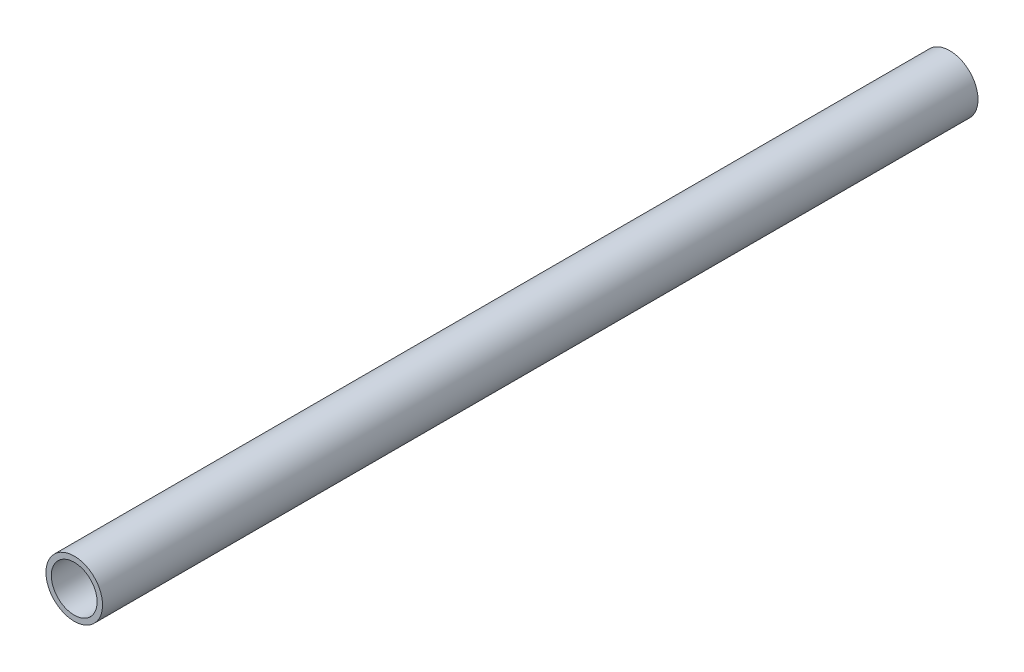
ISO-10303-21;
HEADER;
FILE_DESCRIPTION(('STEP AP214'),'2;1');
FILE_NAME('part.step','',(''),(''),'','','');
FILE_SCHEMA(('AUTOMOTIVE_DESIGN { 1 0 10303 214 1 1 1 1 }'));
ENDSEC;
DATA;
#1=APPLICATION_CONTEXT('core data for automotive mechanical design processes');
#2=APPLICATION_PROTOCOL_DEFINITION('international standard','automotive_design',2000,#1);
#3=PRODUCT_CONTEXT('',#1,'mechanical');
#4=PRODUCT('Part','Part','',(#3));
#5=PRODUCT_RELATED_PRODUCT_CATEGORY('part','',(#4));
#6=PRODUCT_DEFINITION_FORMATION('','',#4);
#7=PRODUCT_DEFINITION_CONTEXT('part definition',#1,'design');
#8=PRODUCT_DEFINITION('design','',#6,#7);
#9=PRODUCT_DEFINITION_SHAPE('','',#8);
#10=(LENGTH_UNIT() NAMED_UNIT(*) SI_UNIT(.MILLI.,.METRE.));
#11=(NAMED_UNIT(*) PLANE_ANGLE_UNIT() SI_UNIT($,.RADIAN.));
#12=(NAMED_UNIT(*) SI_UNIT($,.STERADIAN.) SOLID_ANGLE_UNIT());
#13=UNCERTAINTY_MEASURE_WITH_UNIT(LENGTH_MEASURE(1.E-05),#10,'distance_accuracy_value','');
#14=(GEOMETRIC_REPRESENTATION_CONTEXT(3) GLOBAL_UNCERTAINTY_ASSIGNED_CONTEXT((#13)) GLOBAL_UNIT_ASSIGNED_CONTEXT((#10,
#11,#12)) REPRESENTATION_CONTEXT('',''));
#15=CARTESIAN_POINT('',(0.,0.,0.));
#16=DIRECTION('',(0.,0.,1.));
#17=DIRECTION('',(1.,0.,0.));
#18=AXIS2_PLACEMENT_3D('',#15,#16,#17);
#19=CARTESIAN_POINT('',(0.,0.,247.65));
#20=DIRECTION('',(0.,0.,1.));
#21=DIRECTION('',(1.,0.,0.));
#22=AXIS2_PLACEMENT_3D('',#19,#20,#21);
#23=PLANE('',#22);
#24=CARTESIAN_POINT('',(0.,0.,247.65));
#25=DIRECTION('',(0.,0.,1.));
#26=DIRECTION('',(1.,0.,0.));
#27=AXIS2_PLACEMENT_3D('',#24,#25,#26);
#28=CIRCLE('',#27,8.001);
#29=CARTESIAN_POINT('',(8.001,0.,247.65));
#30=VERTEX_POINT('',#29);
#31=EDGE_CURVE('E10',#30,#30,#28,.T.);
#32=ORIENTED_EDGE('',*,*,#31,.T.);
#33=EDGE_LOOP('',(#32));
#34=FACE_BOUND('',#33,.T.);
#35=CARTESIAN_POINT('',(0.,0.,247.65));
#36=DIRECTION('',(0.,0.,1.));
#37=DIRECTION('',(1.,0.,0.));
#38=AXIS2_PLACEMENT_3D('',#35,#36,#37);
#39=CIRCLE('',#38,6.477);
#40=CARTESIAN_POINT('',(6.477,0.,247.65));
#41=VERTEX_POINT('',#40);
#42=EDGE_CURVE('E44',#41,#41,#39,.T.);
#43=ORIENTED_EDGE('',*,*,#42,.F.);
#44=EDGE_LOOP('',(#43));
#45=FACE_BOUND('',#44,.T.);
#46=ADVANCED_FACE('F33',(#34,#45),#23,.T.);
#47=CARTESIAN_POINT('',(0.,0.,0.));
#48=DIRECTION('',(0.,0.,1.));
#49=DIRECTION('',(1.,0.,0.));
#50=AXIS2_PLACEMENT_3D('',#47,#48,#49);
#51=PLANE('',#50);
#52=CARTESIAN_POINT('',(0.,0.,0.));
#53=DIRECTION('',(0.,0.,1.));
#54=DIRECTION('',(1.,0.,0.));
#55=AXIS2_PLACEMENT_3D('',#52,#53,#54);
#56=CIRCLE('',#55,8.001);
#57=CARTESIAN_POINT('',(8.001,0.,0.));
#58=VERTEX_POINT('',#57);
#59=EDGE_CURVE('E37',#58,#58,#56,.T.);
#60=ORIENTED_EDGE('',*,*,#59,.F.);
#61=EDGE_LOOP('',(#60));
#62=FACE_BOUND('',#61,.T.);
#63=CARTESIAN_POINT('',(0.,0.,0.));
#64=DIRECTION('',(0.,0.,1.));
#65=DIRECTION('',(1.,0.,0.));
#66=AXIS2_PLACEMENT_3D('',#63,#64,#65);
#67=CIRCLE('',#66,6.477);
#68=CARTESIAN_POINT('',(6.477,0.,0.));
#69=VERTEX_POINT('',#68);
#70=EDGE_CURVE('E46',#69,#69,#67,.T.);
#71=ORIENTED_EDGE('',*,*,#70,.T.);
#72=EDGE_LOOP('',(#71));
#73=FACE_BOUND('',#72,.T.);
#74=ADVANCED_FACE('F56',(#62,#73),#51,.F.);
#75=CARTESIAN_POINT('',(0.,0.,247.65));
#76=DIRECTION('',(0.,0.,-1.));
#77=DIRECTION('',(-1.,0.,0.));
#78=AXIS2_PLACEMENT_3D('',#75,#76,#77);
#79=CYLINDRICAL_SURFACE('',#78,8.001);
#80=ORIENTED_EDGE('',*,*,#31,.F.);
#81=EDGE_LOOP('',(#80));
#82=FACE_BOUND('',#81,.T.);
#83=ORIENTED_EDGE('',*,*,#59,.T.);
#84=EDGE_LOOP('',(#83));
#85=FACE_BOUND('',#84,.T.);
#86=ADVANCED_FACE('F35',(#82,#85),#79,.T.);
#87=CARTESIAN_POINT('',(0.,0.,247.65));
#88=DIRECTION('',(0.,0.,-1.));
#89=DIRECTION('',(-1.,0.,0.));
#90=AXIS2_PLACEMENT_3D('',#87,#88,#89);
#91=CYLINDRICAL_SURFACE('',#90,6.477);
#92=ORIENTED_EDGE('',*,*,#42,.T.);
#93=EDGE_LOOP('',(#92));
#94=FACE_BOUND('',#93,.T.);
#95=ORIENTED_EDGE('',*,*,#70,.F.);
#96=EDGE_LOOP('',(#95));
#97=FACE_BOUND('',#96,.T.);
#98=ADVANCED_FACE('F52',(#94,#97),#91,.F.);
#99=CLOSED_SHELL('',(#46,#74,#86,#98));
#100=MANIFOLD_SOLID_BREP('B2',#99);
#101=ADVANCED_BREP_SHAPE_REPRESENTATION('',(#18,#100),#14);
#102=SHAPE_DEFINITION_REPRESENTATION(#9,#101);
ENDSEC;
END-ISO-10303-21;
